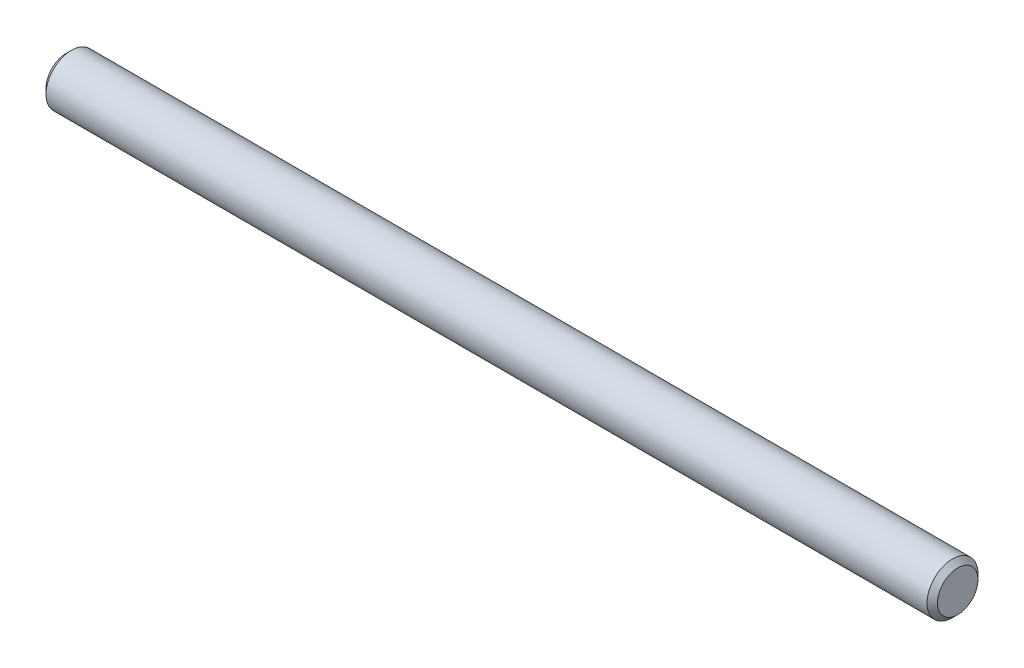
ISO-10303-21;
HEADER;
FILE_DESCRIPTION(('STEP AP214'),'2;1');
FILE_NAME('part.step','',(''),(''),'','','');
FILE_SCHEMA(('AUTOMOTIVE_DESIGN { 1 0 10303 214 1 1 1 1 }'));
ENDSEC;
DATA;
#1=APPLICATION_CONTEXT('core data for automotive mechanical design processes');
#2=APPLICATION_PROTOCOL_DEFINITION('international standard','automotive_design',2000,#1);
#3=PRODUCT_CONTEXT('',#1,'mechanical');
#4=PRODUCT('Part','Part','',(#3));
#5=PRODUCT_RELATED_PRODUCT_CATEGORY('part','',(#4));
#6=PRODUCT_DEFINITION_FORMATION('','',#4);
#7=PRODUCT_DEFINITION_CONTEXT('part definition',#1,'design');
#8=PRODUCT_DEFINITION('design','',#6,#7);
#9=PRODUCT_DEFINITION_SHAPE('','',#8);
#10=(LENGTH_UNIT() NAMED_UNIT(*) SI_UNIT(.MILLI.,.METRE.));
#11=(NAMED_UNIT(*) PLANE_ANGLE_UNIT() SI_UNIT($,.RADIAN.));
#12=(NAMED_UNIT(*) SI_UNIT($,.STERADIAN.) SOLID_ANGLE_UNIT());
#13=UNCERTAINTY_MEASURE_WITH_UNIT(LENGTH_MEASURE(1.E-05),#10,'distance_accuracy_value','');
#14=(GEOMETRIC_REPRESENTATION_CONTEXT(3) GLOBAL_UNCERTAINTY_ASSIGNED_CONTEXT((#13)) GLOBAL_UNIT_ASSIGNED_CONTEXT((#10,
#11,#12)) REPRESENTATION_CONTEXT('',''));
#15=CARTESIAN_POINT('',(0.,0.,0.));
#16=DIRECTION('',(0.,0.,1.));
#17=DIRECTION('',(1.,0.,0.));
#18=AXIS2_PLACEMENT_3D('',#15,#16,#17);
#19=CARTESIAN_POINT('',(-0.000356910630143759,0.,-0.000341554245193443));
#20=DIRECTION('',(-1.,0.,0.));
#21=DIRECTION('',(0.,0.,1.));
#22=AXIS2_PLACEMENT_3D('',#19,#20,#21);
#23=CYLINDRICAL_SURFACE('',#22,3.175);
#24=CARTESIAN_POINT('',(110.49964308937,0.,-0.000341554245193443));
#25=DIRECTION('',(-1.,0.,0.));
#26=DIRECTION('',(0.,0.,1.));
#27=AXIS2_PLACEMENT_3D('',#24,#25,#26);
#28=CIRCLE('',#27,3.175);
#29=CARTESIAN_POINT('',(110.49964308937,0.,3.1746584457548));
#30=VERTEX_POINT('',#29);
#31=EDGE_CURVE('E10',#30,#30,#28,.T.);
#32=ORIENTED_EDGE('',*,*,#31,.T.);
#33=EDGE_LOOP('',(#32));
#34=FACE_BOUND('',#33,.T.);
#35=CARTESIAN_POINT('',(0.649643089369878,0.,-0.000341554245193443));
#36=DIRECTION('',(1.,0.,0.));
#37=DIRECTION('',(0.,0.,1.));
#38=AXIS2_PLACEMENT_3D('',#35,#36,#37);
#39=CIRCLE('',#38,3.175);
#40=CARTESIAN_POINT('',(0.649643089369878,0.,3.1746584457548));
#41=VERTEX_POINT('',#40);
#42=EDGE_CURVE('E22',#41,#41,#39,.T.);
#43=ORIENTED_EDGE('',*,*,#42,.T.);
#44=EDGE_LOOP('',(#43));
#45=FACE_BOUND('',#44,.T.);
#46=ADVANCED_FACE('F14',(#34,#45),#23,.T.);
#47=CARTESIAN_POINT('',(-0.000356910630143759,0.,-0.000341554245193443));
#48=DIRECTION('',(-1.,0.,0.));
#49=DIRECTION('',(0.,0.,1.));
#50=AXIS2_PLACEMENT_3D('',#47,#48,#49);
#51=PLANE('',#50);
#52=CARTESIAN_POINT('',(-0.000356910630143759,0.,-0.000341554245193443));
#53=DIRECTION('',(-1.,0.,0.));
#54=DIRECTION('',(0.,0.,1.));
#55=AXIS2_PLACEMENT_3D('',#52,#53,#54);
#56=CIRCLE('',#55,2.52499999999997);
#57=CARTESIAN_POINT('',(-0.000356910630143759,0.,2.52465844575478));
#58=VERTEX_POINT('',#57);
#59=EDGE_CURVE('E27',#58,#58,#56,.T.);
#60=ORIENTED_EDGE('',*,*,#59,.T.);
#61=EDGE_LOOP('',(#60));
#62=FACE_BOUND('',#61,.T.);
#63=ADVANCED_FACE('F46',(#62),#51,.T.);
#64=CARTESIAN_POINT('',(111.14964308937,0.,-0.000341554245193443));
#65=DIRECTION('',(-1.,0.,0.));
#66=DIRECTION('',(0.,0.,1.));
#67=AXIS2_PLACEMENT_3D('',#64,#65,#66);
#68=PLANE('',#67);
#69=CARTESIAN_POINT('',(111.14964308937,0.,-0.000341554245193443));
#70=DIRECTION('',(1.,0.,0.));
#71=DIRECTION('',(0.,0.,1.));
#72=AXIS2_PLACEMENT_3D('',#69,#70,#71);
#73=CIRCLE('',#72,2.525);
#74=CARTESIAN_POINT('',(111.14964308937,0.,2.52465844575481));
#75=VERTEX_POINT('',#74);
#76=EDGE_CURVE('E18',#75,#75,#73,.T.);
#77=ORIENTED_EDGE('',*,*,#76,.T.);
#78=EDGE_LOOP('',(#77));
#79=FACE_BOUND('',#78,.T.);
#80=ADVANCED_FACE('F35',(#79),#68,.F.);
#81=CARTESIAN_POINT('',(110.49964308937,0.,-0.000341554245193443));
#82=DIRECTION('',(-1.,0.,0.));
#83=DIRECTION('',(0.,0.,1.));
#84=AXIS2_PLACEMENT_3D('',#81,#82,#83);
#85=CONICAL_SURFACE('',#84,3.175,0.785398163397448);
#86=ORIENTED_EDGE('',*,*,#76,.F.);
#87=EDGE_LOOP('',(#86));
#88=FACE_BOUND('',#87,.T.);
#89=ORIENTED_EDGE('',*,*,#31,.F.);
#90=EDGE_LOOP('',(#89));
#91=FACE_BOUND('',#90,.T.);
#92=ADVANCED_FACE('F16',(#88,#91),#85,.T.);
#93=CARTESIAN_POINT('',(-0.000356910630143759,0.,-0.000341554245193443));
#94=DIRECTION('',(1.,0.,0.));
#95=DIRECTION('',(0.,1.,0.));
#96=AXIS2_PLACEMENT_3D('',#93,#94,#95);
#97=CONICAL_SURFACE('',#96,2.52499999999997,0.785398163397448);
#98=ORIENTED_EDGE('',*,*,#42,.F.);
#99=EDGE_LOOP('',(#98));
#100=FACE_BOUND('',#99,.T.);
#101=ORIENTED_EDGE('',*,*,#59,.F.);
#102=EDGE_LOOP('',(#101));
#103=FACE_BOUND('',#102,.T.);
#104=ADVANCED_FACE('F39',(#100,#103),#97,.T.);
#105=CLOSED_SHELL('',(#46,#63,#80,#92,#104));
#106=MANIFOLD_SOLID_BREP('B1',#105);
#107=ADVANCED_BREP_SHAPE_REPRESENTATION('',(#18,#106),#14);
#108=SHAPE_DEFINITION_REPRESENTATION(#9,#107);
ENDSEC;
END-ISO-10303-21;
